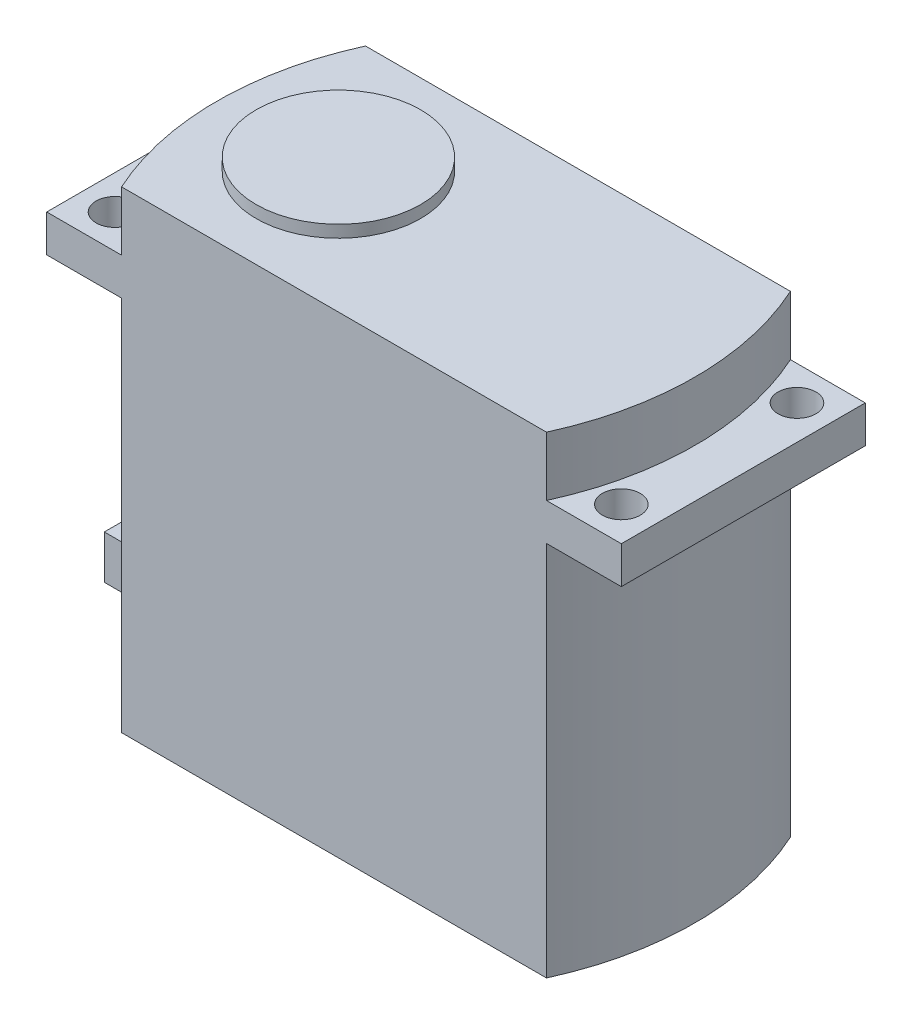
ISO-10303-21;
HEADER;
FILE_DESCRIPTION(('STEP AP214'),'2;1');
FILE_NAME('part.step','',(''),(''),'','','');
FILE_SCHEMA(('AUTOMOTIVE_DESIGN { 1 0 10303 214 1 1 1 1 }'));
ENDSEC;
DATA;
#1=APPLICATION_CONTEXT('core data for automotive mechanical design processes');
#2=APPLICATION_PROTOCOL_DEFINITION('international standard','automotive_design',2000,#1);
#3=PRODUCT_CONTEXT('',#1,'mechanical');
#4=PRODUCT('Part','Part','',(#3));
#5=PRODUCT_RELATED_PRODUCT_CATEGORY('part','',(#4));
#6=PRODUCT_DEFINITION_FORMATION('','',#4);
#7=PRODUCT_DEFINITION_CONTEXT('part definition',#1,'design');
#8=PRODUCT_DEFINITION('design','',#6,#7);
#9=PRODUCT_DEFINITION_SHAPE('','',#8);
#10=(LENGTH_UNIT() NAMED_UNIT(*) SI_UNIT(.MILLI.,.METRE.));
#11=(NAMED_UNIT(*) PLANE_ANGLE_UNIT() SI_UNIT($,.RADIAN.));
#12=(NAMED_UNIT(*) SI_UNIT($,.STERADIAN.) SOLID_ANGLE_UNIT());
#13=UNCERTAINTY_MEASURE_WITH_UNIT(LENGTH_MEASURE(1.E-05),#10,'distance_accuracy_value','');
#14=(GEOMETRIC_REPRESENTATION_CONTEXT(3) GLOBAL_UNCERTAINTY_ASSIGNED_CONTEXT((#13)) GLOBAL_UNIT_ASSIGNED_CONTEXT((#10,
#11,#12)) REPRESENTATION_CONTEXT('',''));
#15=CARTESIAN_POINT('',(0.,0.,0.));
#16=DIRECTION('',(0.,0.,1.));
#17=DIRECTION('',(1.,0.,0.));
#18=AXIS2_PLACEMENT_3D('',#15,#16,#17);
#19=CARTESIAN_POINT('',(-10.,10.55,11.225));
#20=DIRECTION('',(0.,1.,0.));
#21=DIRECTION('',(0.,0.,1.));
#22=AXIS2_PLACEMENT_3D('',#19,#20,#21);
#23=PLANE('',#22);
#24=DIRECTION('',(0.,0.,1.));
#25=VECTOR('',#24,1.);
#26=CARTESIAN_POINT('',(0.,10.55,11.225));
#27=LINE('',#26,#25);
#28=CARTESIAN_POINT('',(0.,10.55,11.225));
#29=VERTEX_POINT('',#28);
#30=CARTESIAN_POINT('',(0.,10.55,20.925));
#31=VERTEX_POINT('',#30);
#32=EDGE_CURVE('E106',#29,#31,#27,.T.);
#33=ORIENTED_EDGE('',*,*,#32,.F.);
#34=DIRECTION('',(1.,0.,0.));
#35=VECTOR('',#34,1.);
#36=CARTESIAN_POINT('',(-10.,10.55,11.225));
#37=LINE('',#36,#35);
#38=CARTESIAN_POINT('',(-10.,10.55,11.225));
#39=VERTEX_POINT('',#38);
#40=EDGE_CURVE('E12',#39,#29,#37,.T.);
#41=ORIENTED_EDGE('',*,*,#40,.F.);
#42=DIRECTION('',(0.,0.,1.));
#43=VECTOR('',#42,1.);
#44=CARTESIAN_POINT('',(-10.,10.55,11.225));
#45=LINE('',#44,#43);
#46=CARTESIAN_POINT('',(-10.,10.55,20.925));
#47=VERTEX_POINT('',#46);
#48=EDGE_CURVE('E100',#39,#47,#45,.T.);
#49=ORIENTED_EDGE('',*,*,#48,.T.);
#50=DIRECTION('',(1.,0.,0.));
#51=VECTOR('',#50,1.);
#52=CARTESIAN_POINT('',(-10.,10.55,20.925));
#53=LINE('',#52,#51);
#54=EDGE_CURVE('E45',#47,#31,#53,.T.);
#55=ORIENTED_EDGE('',*,*,#54,.T.);
#56=EDGE_LOOP('',(#33,#41,#49,#55));
#57=FACE_BOUND('',#56,.T.);
#58=ADVANCED_FACE('F42',(#57),#23,.T.);
#59=CARTESIAN_POINT('',(-10.,4.8,11.225));
#60=DIRECTION('',(0.,0.,-1.));
#61=DIRECTION('',(-1.,0.,0.));
#62=AXIS2_PLACEMENT_3D('',#59,#60,#61);
#63=PLANE('',#62);
#64=DIRECTION('',(0.,1.,0.));
#65=VECTOR('',#64,1.);
#66=CARTESIAN_POINT('',(0.,4.8,11.225));
#67=LINE('',#66,#65);
#68=CARTESIAN_POINT('',(0.,4.8,11.225));
#69=VERTEX_POINT('',#68);
#70=EDGE_CURVE('E102',#69,#29,#67,.T.);
#71=ORIENTED_EDGE('',*,*,#70,.F.);
#72=DIRECTION('',(1.,0.,0.));
#73=VECTOR('',#72,1.);
#74=CARTESIAN_POINT('',(-10.,4.8,11.225));
#75=LINE('',#74,#73);
#76=CARTESIAN_POINT('',(-10.,4.8,11.225));
#77=VERTEX_POINT('',#76);
#78=EDGE_CURVE('E51',#77,#69,#75,.T.);
#79=ORIENTED_EDGE('',*,*,#78,.F.);
#80=DIRECTION('',(0.,1.,0.));
#81=VECTOR('',#80,1.);
#82=CARTESIAN_POINT('',(-10.,4.8,11.225));
#83=LINE('',#82,#81);
#84=EDGE_CURVE('E97',#77,#39,#83,.T.);
#85=ORIENTED_EDGE('',*,*,#84,.T.);
#86=ORIENTED_EDGE('',*,*,#40,.T.);
#87=EDGE_LOOP('',(#71,#79,#85,#86));
#88=FACE_BOUND('',#87,.T.);
#89=ADVANCED_FACE('F116',(#88),#63,.T.);
#90=CARTESIAN_POINT('',(-10.,4.8,20.925));
#91=DIRECTION('',(0.,-1.,0.));
#92=DIRECTION('',(0.,0.,-1.));
#93=AXIS2_PLACEMENT_3D('',#90,#91,#92);
#94=PLANE('',#93);
#95=DIRECTION('',(0.,0.,-1.));
#96=VECTOR('',#95,1.);
#97=CARTESIAN_POINT('',(0.,4.8,20.925));
#98=LINE('',#97,#96);
#99=CARTESIAN_POINT('',(0.,4.8,20.925));
#100=VERTEX_POINT('',#99);
#101=EDGE_CURVE('E92',#100,#69,#98,.T.);
#102=ORIENTED_EDGE('',*,*,#101,.F.);
#103=DIRECTION('',(1.,0.,0.));
#104=VECTOR('',#103,1.);
#105=CARTESIAN_POINT('',(-10.,4.8,20.925));
#106=LINE('',#105,#104);
#107=CARTESIAN_POINT('',(-10.,4.8,20.925));
#108=VERTEX_POINT('',#107);
#109=EDGE_CURVE('E87',#108,#100,#106,.T.);
#110=ORIENTED_EDGE('',*,*,#109,.F.);
#111=DIRECTION('',(0.,0.,-1.));
#112=VECTOR('',#111,1.);
#113=CARTESIAN_POINT('',(-10.,4.8,20.925));
#114=LINE('',#113,#112);
#115=EDGE_CURVE('E90',#108,#77,#114,.T.);
#116=ORIENTED_EDGE('',*,*,#115,.T.);
#117=ORIENTED_EDGE('',*,*,#78,.T.);
#118=EDGE_LOOP('',(#102,#110,#116,#117));
#119=FACE_BOUND('',#118,.T.);
#120=ADVANCED_FACE('F89',(#119),#94,.T.);
#121=CARTESIAN_POINT('',(-10.,10.55,20.925));
#122=DIRECTION('',(0.,0.,1.));
#123=DIRECTION('',(1.,0.,0.));
#124=AXIS2_PLACEMENT_3D('',#121,#122,#123);
#125=PLANE('',#124);
#126=DIRECTION('',(0.,-1.,0.));
#127=VECTOR('',#126,1.);
#128=CARTESIAN_POINT('',(0.,10.55,20.925));
#129=LINE('',#128,#127);
#130=EDGE_CURVE('E109',#31,#100,#129,.T.);
#131=ORIENTED_EDGE('',*,*,#130,.F.);
#132=ORIENTED_EDGE('',*,*,#54,.F.);
#133=DIRECTION('',(0.,-1.,0.));
#134=VECTOR('',#133,1.);
#135=CARTESIAN_POINT('',(-10.,10.55,20.925));
#136=LINE('',#135,#134);
#137=EDGE_CURVE('E96',#47,#108,#136,.T.);
#138=ORIENTED_EDGE('',*,*,#137,.T.);
#139=ORIENTED_EDGE('',*,*,#109,.T.);
#140=EDGE_LOOP('',(#131,#132,#138,#139));
#141=FACE_BOUND('',#140,.T.);
#142=ADVANCED_FACE('F99',(#141),#125,.T.);
#143=CARTESIAN_POINT('',(-10.,0.,0.));
#144=DIRECTION('',(1.,0.,0.));
#145=DIRECTION('',(0.,0.,-1.));
#146=AXIS2_PLACEMENT_3D('',#143,#144,#145);
#147=PLANE('',#146);
#148=ORIENTED_EDGE('',*,*,#48,.F.);
#149=ORIENTED_EDGE('',*,*,#84,.F.);
#150=ORIENTED_EDGE('',*,*,#115,.F.);
#151=ORIENTED_EDGE('',*,*,#137,.F.);
#152=EDGE_LOOP('',(#148,#149,#150,#151));
#153=FACE_BOUND('',#152,.T.);
#154=ADVANCED_FACE('F95',(#153),#147,.F.);
#155=CARTESIAN_POINT('',(0.,0.,0.));
#156=DIRECTION('',(1.,0.,0.));
#157=DIRECTION('',(0.,0.,-1.));
#158=AXIS2_PLACEMENT_3D('',#155,#156,#157);
#159=PLANE('',#158);
#160=ORIENTED_EDGE('',*,*,#32,.T.);
#161=ORIENTED_EDGE('',*,*,#130,.T.);
#162=ORIENTED_EDGE('',*,*,#101,.T.);
#163=ORIENTED_EDGE('',*,*,#70,.T.);
#164=EDGE_LOOP('',(#160,#161,#162,#163));
#165=FACE_BOUND('',#164,.T.);
#166=ADVANCED_FACE('F115',(#165),#159,.T.);
#167=CLOSED_SHELL('',(#58,#89,#120,#142,#154,#166));
#168=MANIFOLD_SOLID_BREP('B2',#167);
#169=CARTESIAN_POINT('',(69.365,54.5,0.));
#170=DIRECTION('',(0.,-1.,0.));
#171=DIRECTION('',(0.,0.,-1.));
#172=AXIS2_PLACEMENT_3D('',#169,#170,#171);
#173=PLANE('',#172);
#174=CARTESIAN_POINT('',(64.865,54.5,4.49999999999998));
#175=DIRECTION('',(0.,-1.,0.));
#176=DIRECTION('',(0.,0.,1.));
#177=AXIS2_PLACEMENT_3D('',#174,#175,#176);
#178=CIRCLE('',#177,2.5);
#179=CARTESIAN_POINT('',(64.865,54.5,6.99999999999998));
#180=VERTEX_POINT('',#179);
#181=EDGE_CURVE('E279',#180,#180,#178,.T.);
#182=ORIENTED_EDGE('',*,*,#181,.T.);
#183=EDGE_LOOP('',(#182));
#184=FACE_BOUND('',#183,.T.);
#185=CARTESIAN_POINT('',(24.3349107142858,54.5,16.075));
#186=DIRECTION('',(0.,-1.,0.));
#187=DIRECTION('',(0.,0.,-1.));
#188=AXIS2_PLACEMENT_3D('',#185,#186,#187);
#189=CIRCLE('',#188,38.6650892857142);
#190=CARTESIAN_POINT('',(59.5,54.5,32.15));
#191=VERTEX_POINT('',#190);
#192=CARTESIAN_POINT('',(59.5,54.5,0.));
#193=VERTEX_POINT('',#192);
#194=EDGE_CURVE('E40',#191,#193,#189,.F.);
#195=ORIENTED_EDGE('',*,*,#194,.F.);
#196=DIRECTION('',(-1.,0.,0.));
#197=VECTOR('',#196,1.);
#198=CARTESIAN_POINT('',(69.365,54.5,32.15));
#199=LINE('',#198,#197);
#200=CARTESIAN_POINT('',(69.365,54.5,32.15));
#201=VERTEX_POINT('',#200);
#202=EDGE_CURVE('E287',#201,#191,#199,.T.);
#203=ORIENTED_EDGE('',*,*,#202,.F.);
#204=DIRECTION('',(0.,0.,1.));
#205=VECTOR('',#204,1.);
#206=CARTESIAN_POINT('',(69.365,54.5,0.));
#207=LINE('',#206,#205);
#208=CARTESIAN_POINT('',(69.365,54.5,0.));
#209=VERTEX_POINT('',#208);
#210=EDGE_CURVE('E271',#209,#201,#207,.T.);
#211=ORIENTED_EDGE('',*,*,#210,.F.);
#212=DIRECTION('',(-1.,0.,0.));
#213=VECTOR('',#212,1.);
#214=CARTESIAN_POINT('',(69.365,54.5,0.));
#215=LINE('',#214,#213);
#216=EDGE_CURVE('E275',#209,#193,#215,.T.);
#217=ORIENTED_EDGE('',*,*,#216,.T.);
#218=EDGE_LOOP('',(#195,#203,#211,#217));
#219=FACE_BOUND('',#218,.T.);
#220=CARTESIAN_POINT('',(64.865,54.5,27.65));
#221=DIRECTION('',(0.,-1.,0.));
#222=DIRECTION('',(0.,0.,1.));
#223=AXIS2_PLACEMENT_3D('',#220,#221,#222);
#224=CIRCLE('',#223,2.5);
#225=CARTESIAN_POINT('',(64.865,54.5,30.15));
#226=VERTEX_POINT('',#225);
#227=EDGE_CURVE('E412',#226,#226,#224,.T.);
#228=ORIENTED_EDGE('',*,*,#227,.T.);
#229=EDGE_LOOP('',(#228));
#230=FACE_BOUND('',#229,.T.);
#231=ADVANCED_FACE('F165',(#184,#219,#230),#173,.F.);
#232=CARTESIAN_POINT('',(69.365,49.6,32.15));
#233=DIRECTION('',(0.,1.,0.));
#234=DIRECTION('',(0.,0.,1.));
#235=AXIS2_PLACEMENT_3D('',#232,#233,#234);
#236=PLANE('',#235);
#237=CARTESIAN_POINT('',(64.865,49.6,4.49999999999998));
#238=DIRECTION('',(0.,1.,0.));
#239=DIRECTION('',(0.,0.,1.));
#240=AXIS2_PLACEMENT_3D('',#237,#238,#239);
#241=CIRCLE('',#240,2.5);
#242=CARTESIAN_POINT('',(64.865,49.6,6.99999999999998));
#243=VERTEX_POINT('',#242);
#244=EDGE_CURVE('E276',#243,#243,#241,.F.);
#245=ORIENTED_EDGE('',*,*,#244,.F.);
#246=EDGE_LOOP('',(#245));
#247=FACE_BOUND('',#246,.T.);
#248=CARTESIAN_POINT('',(24.3349107142858,49.6,16.075));
#249=DIRECTION('',(0.,1.,0.));
#250=DIRECTION('',(0.,0.,1.));
#251=AXIS2_PLACEMENT_3D('',#248,#249,#250);
#252=CIRCLE('',#251,38.6650892857142);
#253=CARTESIAN_POINT('',(59.5,49.6,0.));
#254=VERTEX_POINT('',#253);
#255=CARTESIAN_POINT('',(59.5,49.6,32.15));
#256=VERTEX_POINT('',#255);
#257=EDGE_CURVE('E174',#254,#256,#252,.F.);
#258=ORIENTED_EDGE('',*,*,#257,.F.);
#259=DIRECTION('',(-1.,0.,0.));
#260=VECTOR('',#259,1.);
#261=CARTESIAN_POINT('',(69.365,49.6,0.));
#262=LINE('',#261,#260);
#263=CARTESIAN_POINT('',(69.365,49.6,0.));
#264=VERTEX_POINT('',#263);
#265=EDGE_CURVE('E267',#264,#254,#262,.T.);
#266=ORIENTED_EDGE('',*,*,#265,.F.);
#267=DIRECTION('',(0.,0.,-1.));
#268=VECTOR('',#267,1.);
#269=CARTESIAN_POINT('',(69.365,49.6,32.15));
#270=LINE('',#269,#268);
#271=CARTESIAN_POINT('',(69.365,49.6,32.15));
#272=VERTEX_POINT('',#271);
#273=EDGE_CURVE('E257',#272,#264,#270,.T.);
#274=ORIENTED_EDGE('',*,*,#273,.F.);
#275=DIRECTION('',(-1.,0.,0.));
#276=VECTOR('',#275,1.);
#277=CARTESIAN_POINT('',(69.365,49.6,32.15));
#278=LINE('',#277,#276);
#279=EDGE_CURVE('E182',#272,#256,#278,.T.);
#280=ORIENTED_EDGE('',*,*,#279,.T.);
#281=EDGE_LOOP('',(#258,#266,#274,#280));
#282=FACE_BOUND('',#281,.T.);
#283=CARTESIAN_POINT('',(64.865,49.6,27.65));
#284=DIRECTION('',(0.,1.,0.));
#285=DIRECTION('',(0.,0.,1.));
#286=AXIS2_PLACEMENT_3D('',#283,#284,#285);
#287=CIRCLE('',#286,2.5);
#288=CARTESIAN_POINT('',(64.865,49.6,30.15));
#289=VERTEX_POINT('',#288);
#290=EDGE_CURVE('E169',#289,#289,#287,.F.);
#291=ORIENTED_EDGE('',*,*,#290,.F.);
#292=EDGE_LOOP('',(#291));
#293=FACE_BOUND('',#292,.T.);
#294=ADVANCED_FACE('F268',(#247,#282,#293),#236,.F.);
#295=CARTESIAN_POINT('',(24.3349107142858,0.,16.075));
#296=DIRECTION('',(0.,1.,0.));
#297=DIRECTION('',(0.,0.,1.));
#298=AXIS2_PLACEMENT_3D('',#295,#296,#297);
#299=CYLINDRICAL_SURFACE('',#298,38.6650892857142);
#300=DIRECTION('',(0.,1.,0.));
#301=VECTOR('',#300,1.);
#302=CARTESIAN_POINT('',(59.5,0.,32.15));
#303=LINE('',#302,#301);
#304=CARTESIAN_POINT('',(59.5,62.3,32.15));
#305=VERTEX_POINT('',#304);
#306=EDGE_CURVE('E286',#191,#305,#303,.T.);
#307=ORIENTED_EDGE('',*,*,#306,.F.);
#308=ORIENTED_EDGE('',*,*,#194,.T.);
#309=DIRECTION('',(0.,1.,0.));
#310=VECTOR('',#309,1.);
#311=CARTESIAN_POINT('',(59.5,0.,0.));
#312=LINE('',#311,#310);
#313=CARTESIAN_POINT('',(59.5,62.3,0.));
#314=VERTEX_POINT('',#313);
#315=EDGE_CURVE('E296',#193,#314,#312,.T.);
#316=ORIENTED_EDGE('',*,*,#315,.T.);
#317=CARTESIAN_POINT('',(24.3349107142858,62.3,16.075));
#318=DIRECTION('',(0.,1.,0.));
#319=DIRECTION('',(0.,0.,-1.));
#320=AXIS2_PLACEMENT_3D('',#317,#318,#319);
#321=CIRCLE('',#320,38.6650892857142);
#322=EDGE_CURVE('E294',#305,#314,#321,.T.);
#323=ORIENTED_EDGE('',*,*,#322,.F.);
#324=EDGE_LOOP('',(#307,#308,#316,#323));
#325=FACE_BOUND('',#324,.T.);
#326=ADVANCED_FACE('F403',(#325),#299,.T.);
#327=CARTESIAN_POINT('',(59.5,0.,0.));
#328=VERTEX_POINT('',#327);
#329=EDGE_CURVE('E299',#328,#254,#312,.T.);
#330=ORIENTED_EDGE('',*,*,#329,.T.);
#331=ORIENTED_EDGE('',*,*,#257,.T.);
#332=CARTESIAN_POINT('',(59.5,0.,32.15));
#333=VERTEX_POINT('',#332);
#334=EDGE_CURVE('E291',#333,#256,#303,.T.);
#335=ORIENTED_EDGE('',*,*,#334,.F.);
#336=CARTESIAN_POINT('',(24.3349107142858,0.,16.075));
#337=DIRECTION('',(0.,1.,0.));
#338=DIRECTION('',(0.,0.,-1.));
#339=AXIS2_PLACEMENT_3D('',#336,#337,#338);
#340=CIRCLE('',#339,38.6650892857142);
#341=EDGE_CURVE('E190',#333,#328,#340,.T.);
#342=ORIENTED_EDGE('',*,*,#341,.T.);
#343=EDGE_LOOP('',(#330,#331,#335,#342));
#344=FACE_BOUND('',#343,.T.);
#345=ADVANCED_FACE('F371',(#344),#299,.T.);
#346=CARTESIAN_POINT('',(0.,62.3,32.15));
#347=DIRECTION('',(0.,-1.,0.));
#348=DIRECTION('',(0.,0.,-1.));
#349=AXIS2_PLACEMENT_3D('',#346,#347,#348);
#350=PLANE('',#349);
#351=CARTESIAN_POINT('',(16.,62.3,16.075));
#352=DIRECTION('',(0.,-1.,0.));
#353=DIRECTION('',(0.,0.,-1.));
#354=AXIS2_PLACEMENT_3D('',#351,#352,#353);
#355=CIRCLE('',#354,10.835);
#356=CARTESIAN_POINT('',(16.,62.3,5.24));
#357=VERTEX_POINT('',#356);
#358=EDGE_CURVE('E359',#357,#357,#355,.F.);
#359=ORIENTED_EDGE('',*,*,#358,.F.);
#360=EDGE_LOOP('',(#359));
#361=FACE_BOUND('',#360,.T.);
#362=DIRECTION('',(-1.,0.,0.));
#363=VECTOR('',#362,1.);
#364=CARTESIAN_POINT('',(0.,62.3,32.15));
#365=LINE('',#364,#363);
#366=CARTESIAN_POINT('',(3.5,62.3,32.15));
#367=VERTEX_POINT('',#366);
#368=EDGE_CURVE('E356',#305,#367,#365,.T.);
#369=ORIENTED_EDGE('',*,*,#368,.F.);
#370=ORIENTED_EDGE('',*,*,#322,.T.);
#371=DIRECTION('',(-1.,0.,0.));
#372=VECTOR('',#371,1.);
#373=CARTESIAN_POINT('',(0.,62.3,0.));
#374=LINE('',#373,#372);
#375=CARTESIAN_POINT('',(3.5,62.3,0.));
#376=VERTEX_POINT('',#375);
#377=EDGE_CURVE('E357',#314,#376,#374,.T.);
#378=ORIENTED_EDGE('',*,*,#377,.T.);
#379=CARTESIAN_POINT('',(38.6650892857142,62.3,16.075));
#380=DIRECTION('',(0.,-1.,0.));
#381=DIRECTION('',(0.,0.,-1.));
#382=AXIS2_PLACEMENT_3D('',#379,#380,#381);
#383=CIRCLE('',#382,38.6650892857142);
#384=EDGE_CURVE('E339',#367,#376,#383,.T.);
#385=ORIENTED_EDGE('',*,*,#384,.F.);
#386=EDGE_LOOP('',(#369,#370,#378,#385));
#387=FACE_BOUND('',#386,.T.);
#388=ADVANCED_FACE('F399',(#361,#387),#350,.F.);
#389=CARTESIAN_POINT('',(63.,0.,32.15));
#390=DIRECTION('',(0.,1.,0.));
#391=DIRECTION('',(-1.,0.,0.));
#392=AXIS2_PLACEMENT_3D('',#389,#390,#391);
#393=PLANE('',#392);
#394=ORIENTED_EDGE('',*,*,#341,.F.);
#395=DIRECTION('',(1.,0.,0.));
#396=VECTOR('',#395,1.);
#397=CARTESIAN_POINT('',(63.,0.,32.15));
#398=LINE('',#397,#396);
#399=CARTESIAN_POINT('',(3.5,0.,32.15));
#400=VERTEX_POINT('',#399);
#401=EDGE_CURVE('E353',#400,#333,#398,.T.);
#402=ORIENTED_EDGE('',*,*,#401,.F.);
#403=CARTESIAN_POINT('',(38.6650892857142,0.,16.075));
#404=DIRECTION('',(0.,-1.,0.));
#405=DIRECTION('',(0.,0.,-1.));
#406=AXIS2_PLACEMENT_3D('',#403,#404,#405);
#407=CIRCLE('',#406,38.6650892857142);
#408=CARTESIAN_POINT('',(3.5,0.,0.));
#409=VERTEX_POINT('',#408);
#410=EDGE_CURVE('E340',#400,#409,#407,.T.);
#411=ORIENTED_EDGE('',*,*,#410,.T.);
#412=DIRECTION('',(1.,0.,0.));
#413=VECTOR('',#412,1.);
#414=CARTESIAN_POINT('',(63.,0.,0.));
#415=LINE('',#414,#413);
#416=EDGE_CURVE('E352',#409,#328,#415,.T.);
#417=ORIENTED_EDGE('',*,*,#416,.T.);
#418=EDGE_LOOP('',(#394,#402,#411,#417));
#419=FACE_BOUND('',#418,.T.);
#420=ADVANCED_FACE('F167',(#419),#393,.F.);
#421=CARTESIAN_POINT('',(0.,0.,0.));
#422=DIRECTION('',(0.,0.,-1.));
#423=DIRECTION('',(-1.,0.,0.));
#424=AXIS2_PLACEMENT_3D('',#421,#422,#423);
#425=PLANE('',#424);
#426=ORIENTED_EDGE('',*,*,#265,.T.);
#427=ORIENTED_EDGE('',*,*,#329,.F.);
#428=ORIENTED_EDGE('',*,*,#416,.F.);
#429=DIRECTION('',(0.,1.,0.));
#430=VECTOR('',#429,1.);
#431=CARTESIAN_POINT('',(3.5,0.,0.));
#432=LINE('',#431,#430);
#433=CARTESIAN_POINT('',(3.5,49.6,0.));
#434=VERTEX_POINT('',#433);
#435=EDGE_CURVE('E346',#409,#434,#432,.T.);
#436=ORIENTED_EDGE('',*,*,#435,.T.);
#437=DIRECTION('',(1.,0.,0.));
#438=VECTOR('',#437,1.);
#439=CARTESIAN_POINT('',(-6.365,49.6,0.));
#440=LINE('',#439,#438);
#441=CARTESIAN_POINT('',(-6.365,49.6,0.));
#442=VERTEX_POINT('',#441);
#443=EDGE_CURVE('E326',#442,#434,#440,.T.);
#444=ORIENTED_EDGE('',*,*,#443,.F.);
#445=DIRECTION('',(0.,1.,0.));
#446=VECTOR('',#445,1.);
#447=CARTESIAN_POINT('',(-6.365,49.6,0.));
#448=LINE('',#447,#446);
#449=CARTESIAN_POINT('',(-6.365,54.5,0.));
#450=VERTEX_POINT('',#449);
#451=EDGE_CURVE('E313',#442,#450,#448,.T.);
#452=ORIENTED_EDGE('',*,*,#451,.T.);
#453=DIRECTION('',(1.,0.,0.));
#454=VECTOR('',#453,1.);
#455=CARTESIAN_POINT('',(-6.365,54.5,0.));
#456=LINE('',#455,#454);
#457=CARTESIAN_POINT('',(3.5,54.5,0.));
#458=VERTEX_POINT('',#457);
#459=EDGE_CURVE('E325',#450,#458,#456,.T.);
#460=ORIENTED_EDGE('',*,*,#459,.T.);
#461=EDGE_CURVE('E343',#458,#376,#432,.T.);
#462=ORIENTED_EDGE('',*,*,#461,.T.);
#463=ORIENTED_EDGE('',*,*,#377,.F.);
#464=ORIENTED_EDGE('',*,*,#315,.F.);
#465=ORIENTED_EDGE('',*,*,#216,.F.);
#466=DIRECTION('',(0.,1.,0.));
#467=VECTOR('',#466,1.);
#468=CARTESIAN_POINT('',(69.365,49.6,0.));
#469=LINE('',#468,#467);
#470=EDGE_CURVE('E261',#264,#209,#469,.T.);
#471=ORIENTED_EDGE('',*,*,#470,.F.);
#472=EDGE_LOOP('',(#426,#427,#428,#436,#444,#452,#460,#462,#463,#464,#465,#471));
#473=FACE_BOUND('',#472,.T.);
#474=ADVANCED_FACE('F273',(#473),#425,.T.);
#475=CARTESIAN_POINT('',(38.6650892857142,0.,16.075));
#476=DIRECTION('',(0.,1.,0.));
#477=DIRECTION('',(0.,0.,1.));
#478=AXIS2_PLACEMENT_3D('',#475,#476,#477);
#479=CYLINDRICAL_SURFACE('',#478,38.6650892857142);
#480=DIRECTION('',(0.,1.,0.));
#481=VECTOR('',#480,1.);
#482=CARTESIAN_POINT('',(3.5,0.,32.15));
#483=LINE('',#482,#481);
#484=CARTESIAN_POINT('',(3.5,49.6,32.15));
#485=VERTEX_POINT('',#484);
#486=EDGE_CURVE('E336',#400,#485,#483,.T.);
#487=ORIENTED_EDGE('',*,*,#486,.T.);
#488=CARTESIAN_POINT('',(38.6650892857142,49.6,16.075));
#489=DIRECTION('',(0.,-1.,0.));
#490=DIRECTION('',(0.,0.,-1.));
#491=AXIS2_PLACEMENT_3D('',#488,#489,#490);
#492=CIRCLE('',#491,38.6650892857142);
#493=EDGE_CURVE('E368',#485,#434,#492,.T.);
#494=ORIENTED_EDGE('',*,*,#493,.T.);
#495=ORIENTED_EDGE('',*,*,#435,.F.);
#496=ORIENTED_EDGE('',*,*,#410,.F.);
#497=EDGE_LOOP('',(#487,#494,#495,#496));
#498=FACE_BOUND('',#497,.T.);
#499=ADVANCED_FACE('F380',(#498),#479,.T.);
#500=CARTESIAN_POINT('',(0.,0.,32.15));
#501=DIRECTION('',(0.,0.,-1.));
#502=DIRECTION('',(-1.,0.,0.));
#503=AXIS2_PLACEMENT_3D('',#500,#501,#502);
#504=PLANE('',#503);
#505=ORIENTED_EDGE('',*,*,#334,.T.);
#506=ORIENTED_EDGE('',*,*,#279,.F.);
#507=DIRECTION('',(0.,-1.,0.));
#508=VECTOR('',#507,1.);
#509=CARTESIAN_POINT('',(69.365,54.5,32.15));
#510=LINE('',#509,#508);
#511=EDGE_CURVE('E264',#201,#272,#510,.T.);
#512=ORIENTED_EDGE('',*,*,#511,.F.);
#513=ORIENTED_EDGE('',*,*,#202,.T.);
#514=ORIENTED_EDGE('',*,*,#306,.T.);
#515=ORIENTED_EDGE('',*,*,#368,.T.);
#516=CARTESIAN_POINT('',(3.5,54.5,32.15));
#517=VERTEX_POINT('',#516);
#518=EDGE_CURVE('E328',#517,#367,#483,.T.);
#519=ORIENTED_EDGE('',*,*,#518,.F.);
#520=DIRECTION('',(1.,0.,0.));
#521=VECTOR('',#520,1.);
#522=CARTESIAN_POINT('',(-6.365,54.5,32.15));
#523=LINE('',#522,#521);
#524=CARTESIAN_POINT('',(-6.365,54.5,32.15));
#525=VERTEX_POINT('',#524);
#526=EDGE_CURVE('E332',#525,#517,#523,.T.);
#527=ORIENTED_EDGE('',*,*,#526,.F.);
#528=DIRECTION('',(0.,-1.,0.));
#529=VECTOR('',#528,1.);
#530=CARTESIAN_POINT('',(-6.365,54.5,32.15));
#531=LINE('',#530,#529);
#532=CARTESIAN_POINT('',(-6.365,49.6,32.15));
#533=VERTEX_POINT('',#532);
#534=EDGE_CURVE('E319',#525,#533,#531,.T.);
#535=ORIENTED_EDGE('',*,*,#534,.T.);
#536=DIRECTION('',(1.,0.,0.));
#537=VECTOR('',#536,1.);
#538=CARTESIAN_POINT('',(-6.365,49.6,32.15));
#539=LINE('',#538,#537);
#540=EDGE_CURVE('E329',#533,#485,#539,.T.);
#541=ORIENTED_EDGE('',*,*,#540,.T.);
#542=ORIENTED_EDGE('',*,*,#486,.F.);
#543=ORIENTED_EDGE('',*,*,#401,.T.);
#544=EDGE_LOOP('',(#505,#506,#512,#513,#514,#515,#519,#527,#535,#541,#542,#543));
#545=FACE_BOUND('',#544,.T.);
#546=ADVANCED_FACE('F373',(#545),#504,.F.);
#547=CARTESIAN_POINT('',(16.,63.9,16.075));
#548=DIRECTION('',(0.,-1.,0.));
#549=DIRECTION('',(0.,0.,-1.));
#550=AXIS2_PLACEMENT_3D('',#547,#548,#549);
#551=CYLINDRICAL_SURFACE('',#550,10.835);
#552=CARTESIAN_POINT('',(16.,63.9,16.075));
#553=DIRECTION('',(0.,1.,0.));
#554=DIRECTION('',(0.,0.,1.));
#555=AXIS2_PLACEMENT_3D('',#552,#553,#554);
#556=CIRCLE('',#555,10.835);
#557=CARTESIAN_POINT('',(16.,63.9,26.91));
#558=VERTEX_POINT('',#557);
#559=EDGE_CURVE('E349',#558,#558,#556,.T.);
#560=ORIENTED_EDGE('',*,*,#559,.F.);
#561=EDGE_LOOP('',(#560));
#562=FACE_BOUND('',#561,.T.);
#563=ORIENTED_EDGE('',*,*,#358,.T.);
#564=EDGE_LOOP('',(#563));
#565=FACE_BOUND('',#564,.T.);
#566=ADVANCED_FACE('F457',(#562,#565),#551,.T.);
#567=CARTESIAN_POINT('',(16.,63.9,16.075));
#568=DIRECTION('',(0.,1.,0.));
#569=DIRECTION('',(0.,0.,1.));
#570=AXIS2_PLACEMENT_3D('',#567,#568,#569);
#571=PLANE('',#570);
#572=ORIENTED_EDGE('',*,*,#559,.T.);
#573=EDGE_LOOP('',(#572));
#574=FACE_BOUND('',#573,.T.);
#575=ADVANCED_FACE('F454',(#574),#571,.T.);
#576=ORIENTED_EDGE('',*,*,#461,.F.);
#577=CARTESIAN_POINT('',(38.6650892857142,54.5,16.075));
#578=DIRECTION('',(0.,1.,0.));
#579=DIRECTION('',(0.,0.,1.));
#580=AXIS2_PLACEMENT_3D('',#577,#578,#579);
#581=CIRCLE('',#580,38.6650892857142);
#582=EDGE_CURVE('E365',#458,#517,#581,.T.);
#583=ORIENTED_EDGE('',*,*,#582,.T.);
#584=ORIENTED_EDGE('',*,*,#518,.T.);
#585=ORIENTED_EDGE('',*,*,#384,.T.);
#586=EDGE_LOOP('',(#576,#583,#584,#585));
#587=FACE_BOUND('',#586,.T.);
#588=ADVANCED_FACE('F394',(#587),#479,.T.);
#589=CARTESIAN_POINT('',(-6.365,49.6,32.15));
#590=DIRECTION('',(0.,-1.,0.));
#591=DIRECTION('',(0.,0.,-1.));
#592=AXIS2_PLACEMENT_3D('',#589,#590,#591);
#593=PLANE('',#592);
#594=CARTESIAN_POINT('',(-1.865,49.6,27.65));
#595=DIRECTION('',(0.,-1.,0.));
#596=DIRECTION('',(0.,0.,-1.));
#597=AXIS2_PLACEMENT_3D('',#594,#595,#596);
#598=CIRCLE('',#597,2.5);
#599=CARTESIAN_POINT('',(-1.865,49.6,25.15));
#600=VERTEX_POINT('',#599);
#601=EDGE_CURVE('E304',#600,#600,#598,.T.);
#602=ORIENTED_EDGE('',*,*,#601,.F.);
#603=EDGE_LOOP('',(#602));
#604=FACE_BOUND('',#603,.T.);
#605=CARTESIAN_POINT('',(-1.865,49.6,4.49999999999998));
#606=DIRECTION('',(0.,-1.,0.));
#607=DIRECTION('',(0.,0.,-1.));
#608=AXIS2_PLACEMENT_3D('',#605,#606,#607);
#609=CIRCLE('',#608,2.5);
#610=CARTESIAN_POINT('',(-1.865,49.6,1.99999999999998));
#611=VERTEX_POINT('',#610);
#612=EDGE_CURVE('E310',#611,#611,#609,.T.);
#613=ORIENTED_EDGE('',*,*,#612,.F.);
#614=EDGE_LOOP('',(#613));
#615=FACE_BOUND('',#614,.T.);
#616=ORIENTED_EDGE('',*,*,#493,.F.);
#617=ORIENTED_EDGE('',*,*,#540,.F.);
#618=DIRECTION('',(0.,0.,-1.));
#619=VECTOR('',#618,1.);
#620=CARTESIAN_POINT('',(-6.365,49.6,32.15));
#621=LINE('',#620,#619);
#622=EDGE_CURVE('E322',#533,#442,#621,.T.);
#623=ORIENTED_EDGE('',*,*,#622,.T.);
#624=ORIENTED_EDGE('',*,*,#443,.T.);
#625=EDGE_LOOP('',(#616,#617,#623,#624));
#626=FACE_BOUND('',#625,.T.);
#627=ADVANCED_FACE('F382',(#604,#615,#626),#593,.T.);
#628=CARTESIAN_POINT('',(-6.365,54.5,0.));
#629=DIRECTION('',(0.,1.,0.));
#630=DIRECTION('',(0.,0.,1.));
#631=AXIS2_PLACEMENT_3D('',#628,#629,#630);
#632=PLANE('',#631);
#633=CARTESIAN_POINT('',(-1.865,54.5,27.65));
#634=DIRECTION('',(0.,1.,0.));
#635=DIRECTION('',(0.,0.,1.));
#636=AXIS2_PLACEMENT_3D('',#633,#634,#635);
#637=CIRCLE('',#636,2.5);
#638=CARTESIAN_POINT('',(-1.865,54.5,30.15));
#639=VERTEX_POINT('',#638);
#640=EDGE_CURVE('E301',#639,#639,#637,.T.);
#641=ORIENTED_EDGE('',*,*,#640,.F.);
#642=EDGE_LOOP('',(#641));
#643=FACE_BOUND('',#642,.T.);
#644=CARTESIAN_POINT('',(-1.865,54.5,4.49999999999998));
#645=DIRECTION('',(0.,1.,0.));
#646=DIRECTION('',(0.,0.,1.));
#647=AXIS2_PLACEMENT_3D('',#644,#645,#646);
#648=CIRCLE('',#647,2.5);
#649=CARTESIAN_POINT('',(-1.865,54.5,6.99999999999998));
#650=VERTEX_POINT('',#649);
#651=EDGE_CURVE('E307',#650,#650,#648,.T.);
#652=ORIENTED_EDGE('',*,*,#651,.F.);
#653=EDGE_LOOP('',(#652));
#654=FACE_BOUND('',#653,.T.);
#655=ORIENTED_EDGE('',*,*,#582,.F.);
#656=ORIENTED_EDGE('',*,*,#459,.F.);
#657=DIRECTION('',(0.,0.,1.));
#658=VECTOR('',#657,1.);
#659=CARTESIAN_POINT('',(-6.365,54.5,0.));
#660=LINE('',#659,#658);
#661=EDGE_CURVE('E316',#450,#525,#660,.T.);
#662=ORIENTED_EDGE('',*,*,#661,.T.);
#663=ORIENTED_EDGE('',*,*,#526,.T.);
#664=EDGE_LOOP('',(#655,#656,#662,#663));
#665=FACE_BOUND('',#664,.T.);
#666=ADVANCED_FACE('F445',(#643,#654,#665),#632,.T.);
#667=CARTESIAN_POINT('',(-6.365,0.,0.));
#668=DIRECTION('',(1.,0.,0.));
#669=DIRECTION('',(0.,0.,-1.));
#670=AXIS2_PLACEMENT_3D('',#667,#668,#669);
#671=PLANE('',#670);
#672=ORIENTED_EDGE('',*,*,#451,.F.);
#673=ORIENTED_EDGE('',*,*,#622,.F.);
#674=ORIENTED_EDGE('',*,*,#534,.F.);
#675=ORIENTED_EDGE('',*,*,#661,.F.);
#676=EDGE_LOOP('',(#672,#673,#674,#675));
#677=FACE_BOUND('',#676,.T.);
#678=ADVANCED_FACE('F388',(#677),#671,.F.);
#679=CARTESIAN_POINT('',(-1.865,0.,4.49999999999998));
#680=DIRECTION('',(0.,1.,0.));
#681=DIRECTION('',(0.,0.,1.));
#682=AXIS2_PLACEMENT_3D('',#679,#680,#681);
#683=CYLINDRICAL_SURFACE('',#682,2.5);
#684=ORIENTED_EDGE('',*,*,#612,.T.);
#685=EDGE_LOOP('',(#684));
#686=FACE_BOUND('',#685,.T.);
#687=ORIENTED_EDGE('',*,*,#651,.T.);
#688=EDGE_LOOP('',(#687));
#689=FACE_BOUND('',#688,.T.);
#690=ADVANCED_FACE('F438',(#686,#689),#683,.F.);
#691=CARTESIAN_POINT('',(-1.865,0.,27.65));
#692=DIRECTION('',(0.,1.,0.));
#693=DIRECTION('',(0.,0.,1.));
#694=AXIS2_PLACEMENT_3D('',#691,#692,#693);
#695=CYLINDRICAL_SURFACE('',#694,2.5);
#696=ORIENTED_EDGE('',*,*,#601,.T.);
#697=EDGE_LOOP('',(#696));
#698=FACE_BOUND('',#697,.T.);
#699=ORIENTED_EDGE('',*,*,#640,.T.);
#700=EDGE_LOOP('',(#699));
#701=FACE_BOUND('',#700,.T.);
#702=ADVANCED_FACE('F435',(#698,#701),#695,.F.);
#703=CARTESIAN_POINT('',(69.365,0.,0.));
#704=DIRECTION('',(-1.,0.,0.));
#705=DIRECTION('',(0.,0.,-1.));
#706=AXIS2_PLACEMENT_3D('',#703,#704,#705);
#707=PLANE('',#706);
#708=ORIENTED_EDGE('',*,*,#470,.T.);
#709=ORIENTED_EDGE('',*,*,#210,.T.);
#710=ORIENTED_EDGE('',*,*,#511,.T.);
#711=ORIENTED_EDGE('',*,*,#273,.T.);
#712=EDGE_LOOP('',(#708,#709,#710,#711));
#713=FACE_BOUND('',#712,.T.);
#714=ADVANCED_FACE('F259',(#713),#707,.F.);
#715=CARTESIAN_POINT('',(64.865,0.,4.49999999999998));
#716=DIRECTION('',(0.,1.,0.));
#717=DIRECTION('',(0.,0.,1.));
#718=AXIS2_PLACEMENT_3D('',#715,#716,#717);
#719=CYLINDRICAL_SURFACE('',#718,2.5);
#720=ORIENTED_EDGE('',*,*,#181,.F.);
#721=EDGE_LOOP('',(#720));
#722=FACE_BOUND('',#721,.T.);
#723=ORIENTED_EDGE('',*,*,#244,.T.);
#724=EDGE_LOOP('',(#723));
#725=FACE_BOUND('',#724,.T.);
#726=ADVANCED_FACE('F420',(#722,#725),#719,.F.);
#727=CARTESIAN_POINT('',(64.865,0.,27.65));
#728=DIRECTION('',(0.,1.,0.));
#729=DIRECTION('',(0.,0.,1.));
#730=AXIS2_PLACEMENT_3D('',#727,#728,#729);
#731=CYLINDRICAL_SURFACE('',#730,2.5);
#732=ORIENTED_EDGE('',*,*,#227,.F.);
#733=EDGE_LOOP('',(#732));
#734=FACE_BOUND('',#733,.T.);
#735=ORIENTED_EDGE('',*,*,#290,.T.);
#736=EDGE_LOOP('',(#735));
#737=FACE_BOUND('',#736,.T.);
#738=ADVANCED_FACE('F423',(#734,#737),#731,.F.);
#739=CLOSED_SHELL('',(#231,#294,#326,#345,#388,#420,#474,#499,#546,#566,#575,#588,#627,#666,
#678,#690,#702,#714,#726,#738));
#740=MANIFOLD_SOLID_BREP('B6',#739);
#741=ADVANCED_BREP_SHAPE_REPRESENTATION('',(#18,#168,#740),#14);
#742=SHAPE_DEFINITION_REPRESENTATION(#9,#741);
ENDSEC;
END-ISO-10303-21;
